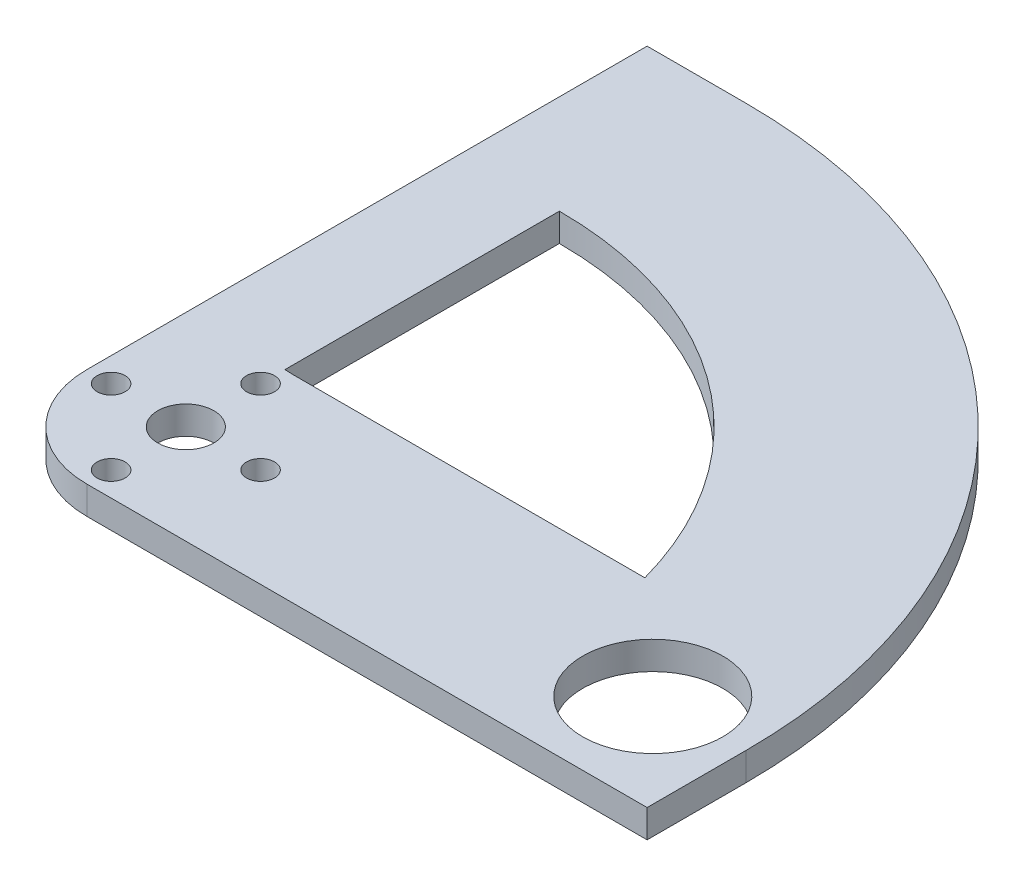
ISO-10303-21;
HEADER;
FILE_DESCRIPTION(('STEP AP214'),'2;1');
FILE_NAME('part.step','',(''),(''),'','','');
FILE_SCHEMA(('AUTOMOTIVE_DESIGN { 1 0 10303 214 1 1 1 1 }'));
ENDSEC;
DATA;
#1=APPLICATION_CONTEXT('core data for automotive mechanical design processes');
#2=APPLICATION_PROTOCOL_DEFINITION('international standard','automotive_design',2000,#1);
#3=PRODUCT_CONTEXT('',#1,'mechanical');
#4=PRODUCT('Part','Part','',(#3));
#5=PRODUCT_RELATED_PRODUCT_CATEGORY('part','',(#4));
#6=PRODUCT_DEFINITION_FORMATION('','',#4);
#7=PRODUCT_DEFINITION_CONTEXT('part definition',#1,'design');
#8=PRODUCT_DEFINITION('design','',#6,#7);
#9=PRODUCT_DEFINITION_SHAPE('','',#8);
#10=(LENGTH_UNIT() NAMED_UNIT(*) SI_UNIT(.MILLI.,.METRE.));
#11=(NAMED_UNIT(*) PLANE_ANGLE_UNIT() SI_UNIT($,.RADIAN.));
#12=(NAMED_UNIT(*) SI_UNIT($,.STERADIAN.) SOLID_ANGLE_UNIT());
#13=UNCERTAINTY_MEASURE_WITH_UNIT(LENGTH_MEASURE(1.E-05),#10,'distance_accuracy_value','');
#14=(GEOMETRIC_REPRESENTATION_CONTEXT(3) GLOBAL_UNCERTAINTY_ASSIGNED_CONTEXT((#13)) GLOBAL_UNIT_ASSIGNED_CONTEXT((#10,
#11,#12)) REPRESENTATION_CONTEXT('',''));
#15=CARTESIAN_POINT('',(0.,0.,0.));
#16=DIRECTION('',(0.,0.,1.));
#17=DIRECTION('',(1.,0.,0.));
#18=AXIS2_PLACEMENT_3D('',#15,#16,#17);
#19=CARTESIAN_POINT('',(0.,3.,0.));
#20=DIRECTION('',(0.,-1.,0.));
#21=DIRECTION('',(0.,0.,-1.));
#22=AXIS2_PLACEMENT_3D('',#19,#20,#21);
#23=PLANE('',#22);
#24=CARTESIAN_POINT('',(0.,3.,8.));
#25=DIRECTION('',(0.,1.,0.));
#26=DIRECTION('',(0.,0.,1.));
#27=AXIS2_PLACEMENT_3D('',#24,#25,#26);
#28=CIRCLE('',#27,1.5);
#29=CARTESIAN_POINT('',(0.,3.,9.5));
#30=VERTEX_POINT('',#29);
#31=EDGE_CURVE('E228',#30,#30,#28,.T.);
#32=ORIENTED_EDGE('',*,*,#31,.F.);
#33=EDGE_LOOP('',(#32));
#34=FACE_BOUND('',#33,.T.);
#35=CARTESIAN_POINT('',(-8.,3.,0.));
#36=DIRECTION('',(0.,1.,0.));
#37=DIRECTION('',(0.,0.,1.));
#38=AXIS2_PLACEMENT_3D('',#35,#36,#37);
#39=CIRCLE('',#38,1.5);
#40=CARTESIAN_POINT('',(-8.,3.,1.5));
#41=VERTEX_POINT('',#40);
#42=EDGE_CURVE('E222',#41,#41,#39,.T.);
#43=ORIENTED_EDGE('',*,*,#42,.F.);
#44=EDGE_LOOP('',(#43));
#45=FACE_BOUND('',#44,.T.);
#46=CARTESIAN_POINT('',(0.,3.,-8.));
#47=DIRECTION('',(0.,1.,0.));
#48=DIRECTION('',(0.,0.,1.));
#49=AXIS2_PLACEMENT_3D('',#46,#47,#48);
#50=CIRCLE('',#49,1.5);
#51=CARTESIAN_POINT('',(0.,3.,-6.5));
#52=VERTEX_POINT('',#51);
#53=EDGE_CURVE('E216',#52,#52,#50,.T.);
#54=ORIENTED_EDGE('',*,*,#53,.F.);
#55=EDGE_LOOP('',(#54));
#56=FACE_BOUND('',#55,.T.);
#57=CARTESIAN_POINT('',(8.,3.,0.));
#58=DIRECTION('',(0.,1.,0.));
#59=DIRECTION('',(0.,0.,1.));
#60=AXIS2_PLACEMENT_3D('',#57,#58,#59);
#61=CIRCLE('',#60,1.5);
#62=CARTESIAN_POINT('',(8.,3.,1.5));
#63=VERTEX_POINT('',#62);
#64=EDGE_CURVE('E210',#63,#63,#61,.T.);
#65=ORIENTED_EDGE('',*,*,#64,.F.);
#66=EDGE_LOOP('',(#65));
#67=FACE_BOUND('',#66,.T.);
#68=DIRECTION('',(0.,0.,-1.));
#69=VECTOR('',#68,1.);
#70=CARTESIAN_POINT('',(0.,3.,0.));
#71=LINE('',#70,#69);
#72=CARTESIAN_POINT('',(0.,3.,-10.6066017177982));
#73=VERTEX_POINT('',#72);
#74=CARTESIAN_POINT('',(0.,3.,-40.));
#75=VERTEX_POINT('',#74);
#76=EDGE_CURVE('E56',#73,#75,#71,.T.);
#77=ORIENTED_EDGE('',*,*,#76,.T.);
#78=CARTESIAN_POINT('',(0.,3.,0.));
#79=DIRECTION('',(0.,1.,0.));
#80=DIRECTION('',(0.,0.,1.));
#81=AXIS2_PLACEMENT_3D('',#78,#79,#80);
#82=CIRCLE('',#81,40.);
#83=CARTESIAN_POINT('',(38.5759452619692,3.,-10.5781117003724));
#84=VERTEX_POINT('',#83);
#85=EDGE_CURVE('E187',#84,#75,#82,.T.);
#86=ORIENTED_EDGE('',*,*,#85,.F.);
#87=DIRECTION('',(1.,0.,0.));
#88=VECTOR('',#87,1.);
#89=CARTESIAN_POINT('',(0.,3.,-10.5781117003724));
#90=LINE('',#89,#88);
#91=CARTESIAN_POINT('',(0.776886641952511,3.,-10.5781117003724));
#92=VERTEX_POINT('',#91);
#93=EDGE_CURVE('E191',#92,#84,#90,.T.);
#94=ORIENTED_EDGE('',*,*,#93,.F.);
#95=CARTESIAN_POINT('',(0.,3.,0.));
#96=DIRECTION('',(0.,1.,0.));
#97=DIRECTION('',(0.,0.,1.));
#98=AXIS2_PLACEMENT_3D('',#95,#96,#97);
#99=CIRCLE('',#98,10.6066017177982);
#100=EDGE_CURVE('E194',#73,#92,#99,.F.);
#101=ORIENTED_EDGE('',*,*,#100,.F.);
#102=EDGE_LOOP('',(#77,#86,#94,#101));
#103=FACE_BOUND('',#102,.T.);
#104=CARTESIAN_POINT('',(0.,3.,0.));
#105=DIRECTION('',(0.,1.,0.));
#106=DIRECTION('',(0.,0.,1.));
#107=AXIS2_PLACEMENT_3D('',#104,#105,#106);
#108=CIRCLE('',#107,3.);
#109=CARTESIAN_POINT('',(0.,3.,3.));
#110=VERTEX_POINT('',#109);
#111=EDGE_CURVE('E156',#110,#110,#108,.T.);
#112=ORIENTED_EDGE('',*,*,#111,.F.);
#113=EDGE_LOOP('',(#112));
#114=FACE_BOUND('',#113,.T.);
#115=CARTESIAN_POINT('',(50.,3.,0.));
#116=DIRECTION('',(0.,1.,0.));
#117=DIRECTION('',(0.,0.,1.));
#118=AXIS2_PLACEMENT_3D('',#115,#116,#117);
#119=CIRCLE('',#118,7.5);
#120=CARTESIAN_POINT('',(50.,3.,7.5));
#121=VERTEX_POINT('',#120);
#122=EDGE_CURVE('E171',#121,#121,#119,.T.);
#123=ORIENTED_EDGE('',*,*,#122,.F.);
#124=EDGE_LOOP('',(#123));
#125=FACE_BOUND('',#124,.T.);
#126=DIRECTION('',(0.,0.,1.));
#127=VECTOR('',#126,1.);
#128=CARTESIAN_POINT('',(-10.6066017177982,3.,-60.));
#129=LINE('',#128,#127);
#130=CARTESIAN_POINT('',(-10.6066017177982,3.,-60.));
#131=VERTEX_POINT('',#130);
#132=CARTESIAN_POINT('',(-10.6066017177982,3.,0.));
#133=VERTEX_POINT('',#132);
#134=EDGE_CURVE('E164',#131,#133,#129,.T.);
#135=ORIENTED_EDGE('',*,*,#134,.T.);
#136=CARTESIAN_POINT('',(0.,3.,0.));
#137=DIRECTION('',(0.,1.,0.));
#138=DIRECTION('',(0.,0.,1.));
#139=AXIS2_PLACEMENT_3D('',#136,#137,#138);
#140=CIRCLE('',#139,10.6066017177982);
#141=CARTESIAN_POINT('',(0.,3.,10.6066017177982));
#142=VERTEX_POINT('',#141);
#143=EDGE_CURVE('E111',#142,#133,#140,.F.);
#144=ORIENTED_EDGE('',*,*,#143,.F.);
#145=DIRECTION('',(1.,0.,0.));
#146=VECTOR('',#145,1.);
#147=CARTESIAN_POINT('',(-10.6066017177982,3.,10.6066017177982));
#148=LINE('',#147,#146);
#149=CARTESIAN_POINT('',(60.,3.,10.6066017177982));
#150=VERTEX_POINT('',#149);
#151=EDGE_CURVE('E162',#142,#150,#148,.T.);
#152=ORIENTED_EDGE('',*,*,#151,.T.);
#153=DIRECTION('',(0.,0.,-1.));
#154=VECTOR('',#153,1.);
#155=CARTESIAN_POINT('',(60.,3.,0.));
#156=LINE('',#155,#154);
#157=CARTESIAN_POINT('',(60.,3.,0.));
#158=VERTEX_POINT('',#157);
#159=EDGE_CURVE('E143',#150,#158,#156,.T.);
#160=ORIENTED_EDGE('',*,*,#159,.T.);
#161=CARTESIAN_POINT('',(0.,3.,0.));
#162=DIRECTION('',(0.,1.,0.));
#163=DIRECTION('',(0.,0.,-1.));
#164=AXIS2_PLACEMENT_3D('',#161,#162,#163);
#165=CIRCLE('',#164,60.);
#166=CARTESIAN_POINT('',(0.,3.,-60.));
#167=VERTEX_POINT('',#166);
#168=EDGE_CURVE('E138',#158,#167,#165,.T.);
#169=ORIENTED_EDGE('',*,*,#168,.T.);
#170=DIRECTION('',(-1.,0.,0.));
#171=VECTOR('',#170,1.);
#172=CARTESIAN_POINT('',(0.,3.,-60.));
#173=LINE('',#172,#171);
#174=EDGE_CURVE('E166',#167,#131,#173,.T.);
#175=ORIENTED_EDGE('',*,*,#174,.T.);
#176=EDGE_LOOP('',(#135,#144,#152,#160,#169,#175));
#177=FACE_BOUND('',#176,.T.);
#178=ADVANCED_FACE('F33',(#34,#45,#56,#67,#103,#114,#125,#177),#23,.F.);
#179=CARTESIAN_POINT('',(0.,0.,0.));
#180=DIRECTION('',(0.,-1.,0.));
#181=DIRECTION('',(0.,0.,-1.));
#182=AXIS2_PLACEMENT_3D('',#179,#180,#181);
#183=PLANE('',#182);
#184=CARTESIAN_POINT('',(0.,0.,8.));
#185=DIRECTION('',(0.,1.,0.));
#186=DIRECTION('',(0.,0.,1.));
#187=AXIS2_PLACEMENT_3D('',#184,#185,#186);
#188=CIRCLE('',#187,1.5);
#189=CARTESIAN_POINT('',(0.,0.,9.5));
#190=VERTEX_POINT('',#189);
#191=EDGE_CURVE('E213',#190,#190,#188,.T.);
#192=ORIENTED_EDGE('',*,*,#191,.T.);
#193=EDGE_LOOP('',(#192));
#194=FACE_BOUND('',#193,.T.);
#195=CARTESIAN_POINT('',(-8.,0.,0.));
#196=DIRECTION('',(0.,1.,0.));
#197=DIRECTION('',(0.,0.,1.));
#198=AXIS2_PLACEMENT_3D('',#195,#196,#197);
#199=CIRCLE('',#198,1.5);
#200=CARTESIAN_POINT('',(-8.,0.,1.5));
#201=VERTEX_POINT('',#200);
#202=EDGE_CURVE('E225',#201,#201,#199,.T.);
#203=ORIENTED_EDGE('',*,*,#202,.T.);
#204=EDGE_LOOP('',(#203));
#205=FACE_BOUND('',#204,.T.);
#206=CARTESIAN_POINT('',(0.,0.,-8.));
#207=DIRECTION('',(0.,1.,0.));
#208=DIRECTION('',(0.,0.,1.));
#209=AXIS2_PLACEMENT_3D('',#206,#207,#208);
#210=CIRCLE('',#209,1.5);
#211=CARTESIAN_POINT('',(0.,0.,-6.5));
#212=VERTEX_POINT('',#211);
#213=EDGE_CURVE('E219',#212,#212,#210,.T.);
#214=ORIENTED_EDGE('',*,*,#213,.T.);
#215=EDGE_LOOP('',(#214));
#216=FACE_BOUND('',#215,.T.);
#217=CARTESIAN_POINT('',(8.,0.,0.));
#218=DIRECTION('',(0.,1.,0.));
#219=DIRECTION('',(0.,0.,1.));
#220=AXIS2_PLACEMENT_3D('',#217,#218,#219);
#221=CIRCLE('',#220,1.5);
#222=CARTESIAN_POINT('',(8.,0.,1.5));
#223=VERTEX_POINT('',#222);
#224=EDGE_CURVE('E208',#223,#223,#221,.T.);
#225=ORIENTED_EDGE('',*,*,#224,.T.);
#226=EDGE_LOOP('',(#225));
#227=FACE_BOUND('',#226,.T.);
#228=CARTESIAN_POINT('',(50.,0.,0.));
#229=DIRECTION('',(0.,1.,0.));
#230=DIRECTION('',(0.,0.,1.));
#231=AXIS2_PLACEMENT_3D('',#228,#229,#230);
#232=CIRCLE('',#231,7.5);
#233=CARTESIAN_POINT('',(50.,0.,7.5));
#234=VERTEX_POINT('',#233);
#235=EDGE_CURVE('E173',#234,#234,#232,.T.);
#236=ORIENTED_EDGE('',*,*,#235,.T.);
#237=EDGE_LOOP('',(#236));
#238=FACE_BOUND('',#237,.T.);
#239=CARTESIAN_POINT('',(0.,0.,0.));
#240=DIRECTION('',(0.,1.,0.));
#241=DIRECTION('',(0.,0.,1.));
#242=AXIS2_PLACEMENT_3D('',#239,#240,#241);
#243=CIRCLE('',#242,3.);
#244=CARTESIAN_POINT('',(0.,0.,3.));
#245=VERTEX_POINT('',#244);
#246=EDGE_CURVE('E158',#245,#245,#243,.T.);
#247=ORIENTED_EDGE('',*,*,#246,.T.);
#248=EDGE_LOOP('',(#247));
#249=FACE_BOUND('',#248,.T.);
#250=CARTESIAN_POINT('',(0.,0.,0.));
#251=DIRECTION('',(0.,1.,0.));
#252=DIRECTION('',(0.,0.,1.));
#253=AXIS2_PLACEMENT_3D('',#250,#251,#252);
#254=CIRCLE('',#253,40.);
#255=CARTESIAN_POINT('',(38.5759452619692,0.,-10.5781117003724));
#256=VERTEX_POINT('',#255);
#257=CARTESIAN_POINT('',(0.,0.,-40.));
#258=VERTEX_POINT('',#257);
#259=EDGE_CURVE('E182',#256,#258,#254,.T.);
#260=ORIENTED_EDGE('',*,*,#259,.T.);
#261=DIRECTION('',(0.,0.,-1.));
#262=VECTOR('',#261,1.);
#263=CARTESIAN_POINT('',(0.,0.,0.));
#264=LINE('',#263,#262);
#265=CARTESIAN_POINT('',(0.,0.,-10.6066017177982));
#266=VERTEX_POINT('',#265);
#267=EDGE_CURVE('E190',#266,#258,#264,.T.);
#268=ORIENTED_EDGE('',*,*,#267,.F.);
#269=CARTESIAN_POINT('',(0.,0.,0.));
#270=DIRECTION('',(0.,1.,0.));
#271=DIRECTION('',(0.,0.,1.));
#272=AXIS2_PLACEMENT_3D('',#269,#270,#271);
#273=CIRCLE('',#272,10.6066017177982);
#274=CARTESIAN_POINT('',(0.776886641952511,0.,-10.5781117003724));
#275=VERTEX_POINT('',#274);
#276=EDGE_CURVE('E203',#266,#275,#273,.F.);
#277=ORIENTED_EDGE('',*,*,#276,.T.);
#278=DIRECTION('',(1.,0.,0.));
#279=VECTOR('',#278,1.);
#280=CARTESIAN_POINT('',(0.,0.,-10.5781117003724));
#281=LINE('',#280,#279);
#282=EDGE_CURVE('E200',#275,#256,#281,.T.);
#283=ORIENTED_EDGE('',*,*,#282,.T.);
#284=EDGE_LOOP('',(#260,#268,#277,#283));
#285=FACE_BOUND('',#284,.T.);
#286=CARTESIAN_POINT('',(0.,0.,0.));
#287=DIRECTION('',(0.,1.,0.));
#288=DIRECTION('',(0.,0.,1.));
#289=AXIS2_PLACEMENT_3D('',#286,#287,#288);
#290=CIRCLE('',#289,10.6066017177982);
#291=CARTESIAN_POINT('',(0.,0.,10.6066017177982));
#292=VERTEX_POINT('',#291);
#293=CARTESIAN_POINT('',(-10.6066017177982,0.,0.));
#294=VERTEX_POINT('',#293);
#295=EDGE_CURVE('E48',#292,#294,#290,.F.);
#296=ORIENTED_EDGE('',*,*,#295,.T.);
#297=DIRECTION('',(0.,0.,1.));
#298=VECTOR('',#297,1.);
#299=CARTESIAN_POINT('',(-10.6066017177982,0.,-60.));
#300=LINE('',#299,#298);
#301=CARTESIAN_POINT('',(-10.6066017177982,0.,-60.));
#302=VERTEX_POINT('',#301);
#303=EDGE_CURVE('E122',#302,#294,#300,.T.);
#304=ORIENTED_EDGE('',*,*,#303,.F.);
#305=DIRECTION('',(-1.,0.,0.));
#306=VECTOR('',#305,1.);
#307=CARTESIAN_POINT('',(0.,0.,-60.));
#308=LINE('',#307,#306);
#309=CARTESIAN_POINT('',(0.,0.,-60.));
#310=VERTEX_POINT('',#309);
#311=EDGE_CURVE('E129',#310,#302,#308,.T.);
#312=ORIENTED_EDGE('',*,*,#311,.F.);
#313=CARTESIAN_POINT('',(0.,0.,0.));
#314=DIRECTION('',(0.,1.,0.));
#315=DIRECTION('',(0.,0.,-1.));
#316=AXIS2_PLACEMENT_3D('',#313,#314,#315);
#317=CIRCLE('',#316,60.);
#318=CARTESIAN_POINT('',(60.,0.,0.));
#319=VERTEX_POINT('',#318);
#320=EDGE_CURVE('E133',#319,#310,#317,.T.);
#321=ORIENTED_EDGE('',*,*,#320,.F.);
#322=DIRECTION('',(0.,0.,-1.));
#323=VECTOR('',#322,1.);
#324=CARTESIAN_POINT('',(60.,0.,0.));
#325=LINE('',#324,#323);
#326=CARTESIAN_POINT('',(60.,0.,10.6066017177982));
#327=VERTEX_POINT('',#326);
#328=EDGE_CURVE('E131',#327,#319,#325,.T.);
#329=ORIENTED_EDGE('',*,*,#328,.F.);
#330=DIRECTION('',(1.,0.,0.));
#331=VECTOR('',#330,1.);
#332=CARTESIAN_POINT('',(-10.6066017177982,0.,10.6066017177982));
#333=LINE('',#332,#331);
#334=EDGE_CURVE('E124',#292,#327,#333,.T.);
#335=ORIENTED_EDGE('',*,*,#334,.F.);
#336=EDGE_LOOP('',(#296,#304,#312,#321,#329,#335));
#337=FACE_BOUND('',#336,.T.);
#338=ADVANCED_FACE('F121',(#194,#205,#216,#227,#238,#249,#285,#337),#183,.T.);
#339=CARTESIAN_POINT('',(-10.6066017177982,3.,-60.));
#340=DIRECTION('',(1.,0.,0.));
#341=DIRECTION('',(0.,0.,-1.));
#342=AXIS2_PLACEMENT_3D('',#339,#340,#341);
#343=PLANE('',#342);
#344=DIRECTION('',(0.,1.,0.));
#345=VECTOR('',#344,1.);
#346=CARTESIAN_POINT('',(-10.6066017177982,0.,0.));
#347=LINE('',#346,#345);
#348=EDGE_CURVE('E108',#294,#133,#347,.T.);
#349=ORIENTED_EDGE('',*,*,#348,.T.);
#350=ORIENTED_EDGE('',*,*,#134,.F.);
#351=DIRECTION('',(0.,-1.,0.));
#352=VECTOR('',#351,1.);
#353=CARTESIAN_POINT('',(-10.6066017177982,3.,-60.));
#354=LINE('',#353,#352);
#355=EDGE_CURVE('E41',#131,#302,#354,.T.);
#356=ORIENTED_EDGE('',*,*,#355,.T.);
#357=ORIENTED_EDGE('',*,*,#303,.T.);
#358=EDGE_LOOP('',(#349,#350,#356,#357));
#359=FACE_BOUND('',#358,.T.);
#360=ADVANCED_FACE('F127',(#359),#343,.F.);
#361=CARTESIAN_POINT('',(0.,3.,0.));
#362=DIRECTION('',(0.,-1.,0.));
#363=DIRECTION('',(0.,0.,-1.));
#364=AXIS2_PLACEMENT_3D('',#361,#362,#363);
#365=CYLINDRICAL_SURFACE('',#364,60.);
#366=ORIENTED_EDGE('',*,*,#320,.T.);
#367=DIRECTION('',(0.,-1.,0.));
#368=VECTOR('',#367,1.);
#369=CARTESIAN_POINT('',(0.,3.,-60.));
#370=LINE('',#369,#368);
#371=EDGE_CURVE('E11',#167,#310,#370,.T.);
#372=ORIENTED_EDGE('',*,*,#371,.F.);
#373=ORIENTED_EDGE('',*,*,#168,.F.);
#374=DIRECTION('',(0.,-1.,0.));
#375=VECTOR('',#374,1.);
#376=CARTESIAN_POINT('',(60.,3.,0.));
#377=LINE('',#376,#375);
#378=EDGE_CURVE('E139',#158,#319,#377,.T.);
#379=ORIENTED_EDGE('',*,*,#378,.T.);
#380=EDGE_LOOP('',(#366,#372,#373,#379));
#381=FACE_BOUND('',#380,.T.);
#382=ADVANCED_FACE('F35',(#381),#365,.T.);
#383=CARTESIAN_POINT('',(0.,3.,-60.));
#384=DIRECTION('',(0.,0.,1.));
#385=DIRECTION('',(1.,0.,0.));
#386=AXIS2_PLACEMENT_3D('',#383,#384,#385);
#387=PLANE('',#386);
#388=ORIENTED_EDGE('',*,*,#311,.T.);
#389=ORIENTED_EDGE('',*,*,#355,.F.);
#390=ORIENTED_EDGE('',*,*,#174,.F.);
#391=ORIENTED_EDGE('',*,*,#371,.T.);
#392=EDGE_LOOP('',(#388,#389,#390,#391));
#393=FACE_BOUND('',#392,.T.);
#394=ADVANCED_FACE('F261',(#393),#387,.F.);
#395=CARTESIAN_POINT('',(-10.6066017177982,3.,10.6066017177982));
#396=DIRECTION('',(0.,0.,-1.));
#397=DIRECTION('',(-1.,0.,0.));
#398=AXIS2_PLACEMENT_3D('',#395,#396,#397);
#399=PLANE('',#398);
#400=ORIENTED_EDGE('',*,*,#151,.F.);
#401=DIRECTION('',(0.,1.,0.));
#402=VECTOR('',#401,1.);
#403=CARTESIAN_POINT('',(0.,0.,10.6066017177982));
#404=LINE('',#403,#402);
#405=EDGE_CURVE('E116',#292,#142,#404,.T.);
#406=ORIENTED_EDGE('',*,*,#405,.F.);
#407=ORIENTED_EDGE('',*,*,#334,.T.);
#408=DIRECTION('',(0.,-1.,0.));
#409=VECTOR('',#408,1.);
#410=CARTESIAN_POINT('',(60.,3.,10.6066017177982));
#411=LINE('',#410,#409);
#412=EDGE_CURVE('E142',#150,#327,#411,.T.);
#413=ORIENTED_EDGE('',*,*,#412,.F.);
#414=EDGE_LOOP('',(#400,#406,#407,#413));
#415=FACE_BOUND('',#414,.T.);
#416=ADVANCED_FACE('F267',(#415),#399,.F.);
#417=CARTESIAN_POINT('',(60.,3.,0.));
#418=DIRECTION('',(-1.,0.,0.));
#419=DIRECTION('',(0.,0.,1.));
#420=AXIS2_PLACEMENT_3D('',#417,#418,#419);
#421=PLANE('',#420);
#422=ORIENTED_EDGE('',*,*,#328,.T.);
#423=ORIENTED_EDGE('',*,*,#378,.F.);
#424=ORIENTED_EDGE('',*,*,#159,.F.);
#425=ORIENTED_EDGE('',*,*,#412,.T.);
#426=EDGE_LOOP('',(#422,#423,#424,#425));
#427=FACE_BOUND('',#426,.T.);
#428=ADVANCED_FACE('F148',(#427),#421,.F.);
#429=CARTESIAN_POINT('',(0.,3.,0.));
#430=DIRECTION('',(0.,-1.,0.));
#431=DIRECTION('',(0.,0.,-1.));
#432=AXIS2_PLACEMENT_3D('',#429,#430,#431);
#433=CYLINDRICAL_SURFACE('',#432,3.);
#434=ORIENTED_EDGE('',*,*,#111,.T.);
#435=EDGE_LOOP('',(#434));
#436=FACE_BOUND('',#435,.T.);
#437=ORIENTED_EDGE('',*,*,#246,.F.);
#438=EDGE_LOOP('',(#437));
#439=FACE_BOUND('',#438,.T.);
#440=ADVANCED_FACE('F278',(#436,#439),#433,.F.);
#441=CARTESIAN_POINT('',(50.,3.,0.));
#442=DIRECTION('',(0.,-1.,0.));
#443=DIRECTION('',(0.,0.,-1.));
#444=AXIS2_PLACEMENT_3D('',#441,#442,#443);
#445=CYLINDRICAL_SURFACE('',#444,7.5);
#446=ORIENTED_EDGE('',*,*,#122,.T.);
#447=EDGE_LOOP('',(#446));
#448=FACE_BOUND('',#447,.T.);
#449=ORIENTED_EDGE('',*,*,#235,.F.);
#450=EDGE_LOOP('',(#449));
#451=FACE_BOUND('',#450,.T.);
#452=ADVANCED_FACE('F282',(#448,#451),#445,.F.);
#453=CARTESIAN_POINT('',(0.,0.,0.));
#454=DIRECTION('',(1.,0.,0.));
#455=DIRECTION('',(0.,0.,-1.));
#456=AXIS2_PLACEMENT_3D('',#453,#454,#455);
#457=PLANE('',#456);
#458=ORIENTED_EDGE('',*,*,#76,.F.);
#459=DIRECTION('',(0.,1.,0.));
#460=VECTOR('',#459,1.);
#461=CARTESIAN_POINT('',(0.,0.,-10.6066017177982));
#462=LINE('',#461,#460);
#463=EDGE_CURVE('E179',#266,#73,#462,.T.);
#464=ORIENTED_EDGE('',*,*,#463,.F.);
#465=ORIENTED_EDGE('',*,*,#267,.T.);
#466=DIRECTION('',(0.,1.,0.));
#467=VECTOR('',#466,1.);
#468=CARTESIAN_POINT('',(0.,0.,-40.));
#469=LINE('',#468,#467);
#470=EDGE_CURVE('E176',#258,#75,#469,.T.);
#471=ORIENTED_EDGE('',*,*,#470,.T.);
#472=EDGE_LOOP('',(#458,#464,#465,#471));
#473=FACE_BOUND('',#472,.T.);
#474=ADVANCED_FACE('F286',(#473),#457,.T.);
#475=CARTESIAN_POINT('',(0.,0.,0.));
#476=DIRECTION('',(0.,1.,0.));
#477=DIRECTION('',(0.,0.,1.));
#478=AXIS2_PLACEMENT_3D('',#475,#476,#477);
#479=CYLINDRICAL_SURFACE('',#478,40.);
#480=ORIENTED_EDGE('',*,*,#85,.T.);
#481=ORIENTED_EDGE('',*,*,#470,.F.);
#482=ORIENTED_EDGE('',*,*,#259,.F.);
#483=DIRECTION('',(0.,1.,0.));
#484=VECTOR('',#483,1.);
#485=CARTESIAN_POINT('',(38.5759452619692,0.,-10.5781117003724));
#486=LINE('',#485,#484);
#487=EDGE_CURVE('E184',#256,#84,#486,.T.);
#488=ORIENTED_EDGE('',*,*,#487,.T.);
#489=EDGE_LOOP('',(#480,#481,#482,#488));
#490=FACE_BOUND('',#489,.T.);
#491=ADVANCED_FACE('F290',(#490),#479,.F.);
#492=CARTESIAN_POINT('',(0.,0.,-10.5781117003724));
#493=DIRECTION('',(0.,0.,1.));
#494=DIRECTION('',(1.,0.,0.));
#495=AXIS2_PLACEMENT_3D('',#492,#493,#494);
#496=PLANE('',#495);
#497=ORIENTED_EDGE('',*,*,#93,.T.);
#498=ORIENTED_EDGE('',*,*,#487,.F.);
#499=ORIENTED_EDGE('',*,*,#282,.F.);
#500=DIRECTION('',(0.,1.,0.));
#501=VECTOR('',#500,1.);
#502=CARTESIAN_POINT('',(0.776886641952511,0.,-10.5781117003724));
#503=LINE('',#502,#501);
#504=EDGE_CURVE('E181',#275,#92,#503,.T.);
#505=ORIENTED_EDGE('',*,*,#504,.T.);
#506=EDGE_LOOP('',(#497,#498,#499,#505));
#507=FACE_BOUND('',#506,.T.);
#508=ADVANCED_FACE('F294',(#507),#496,.F.);
#509=CARTESIAN_POINT('',(0.,0.,0.));
#510=DIRECTION('',(0.,1.,0.));
#511=DIRECTION('',(0.,0.,1.));
#512=AXIS2_PLACEMENT_3D('',#509,#510,#511);
#513=CYLINDRICAL_SURFACE('',#512,10.6066017177982);
#514=ORIENTED_EDGE('',*,*,#100,.T.);
#515=ORIENTED_EDGE('',*,*,#504,.F.);
#516=ORIENTED_EDGE('',*,*,#276,.F.);
#517=ORIENTED_EDGE('',*,*,#463,.T.);
#518=EDGE_LOOP('',(#514,#515,#516,#517));
#519=FACE_BOUND('',#518,.T.);
#520=ADVANCED_FACE('F291',(#519),#513,.T.);
#521=CARTESIAN_POINT('',(0.,0.,0.));
#522=DIRECTION('',(0.,1.,0.));
#523=DIRECTION('',(0.,0.,1.));
#524=AXIS2_PLACEMENT_3D('',#521,#522,#523);
#525=CYLINDRICAL_SURFACE('',#524,10.6066017177982);
#526=ORIENTED_EDGE('',*,*,#143,.T.);
#527=ORIENTED_EDGE('',*,*,#348,.F.);
#528=ORIENTED_EDGE('',*,*,#295,.F.);
#529=ORIENTED_EDGE('',*,*,#405,.T.);
#530=EDGE_LOOP('',(#526,#527,#528,#529));
#531=FACE_BOUND('',#530,.T.);
#532=ADVANCED_FACE('F109',(#531),#525,.T.);
#533=CARTESIAN_POINT('',(8.,0.,0.));
#534=DIRECTION('',(0.,1.,0.));
#535=DIRECTION('',(0.,0.,1.));
#536=AXIS2_PLACEMENT_3D('',#533,#534,#535);
#537=CYLINDRICAL_SURFACE('',#536,1.5);
#538=ORIENTED_EDGE('',*,*,#224,.F.);
#539=EDGE_LOOP('',(#538));
#540=FACE_BOUND('',#539,.T.);
#541=ORIENTED_EDGE('',*,*,#64,.T.);
#542=EDGE_LOOP('',(#541));
#543=FACE_BOUND('',#542,.T.);
#544=ADVANCED_FACE('F304',(#540,#543),#537,.F.);
#545=CARTESIAN_POINT('',(0.,0.,-8.));
#546=DIRECTION('',(0.,1.,0.));
#547=DIRECTION('',(0.,0.,1.));
#548=AXIS2_PLACEMENT_3D('',#545,#546,#547);
#549=CYLINDRICAL_SURFACE('',#548,1.5);
#550=ORIENTED_EDGE('',*,*,#213,.F.);
#551=EDGE_LOOP('',(#550));
#552=FACE_BOUND('',#551,.T.);
#553=ORIENTED_EDGE('',*,*,#53,.T.);
#554=EDGE_LOOP('',(#553));
#555=FACE_BOUND('',#554,.T.);
#556=ADVANCED_FACE('F307',(#552,#555),#549,.F.);
#557=CARTESIAN_POINT('',(-8.,0.,0.));
#558=DIRECTION('',(0.,1.,0.));
#559=DIRECTION('',(0.,0.,1.));
#560=AXIS2_PLACEMENT_3D('',#557,#558,#559);
#561=CYLINDRICAL_SURFACE('',#560,1.5);
#562=ORIENTED_EDGE('',*,*,#202,.F.);
#563=EDGE_LOOP('',(#562));
#564=FACE_BOUND('',#563,.T.);
#565=ORIENTED_EDGE('',*,*,#42,.T.);
#566=EDGE_LOOP('',(#565));
#567=FACE_BOUND('',#566,.T.);
#568=ADVANCED_FACE('F239',(#564,#567),#561,.F.);
#569=CARTESIAN_POINT('',(0.,0.,8.));
#570=DIRECTION('',(0.,1.,0.));
#571=DIRECTION('',(0.,0.,1.));
#572=AXIS2_PLACEMENT_3D('',#569,#570,#571);
#573=CYLINDRICAL_SURFACE('',#572,1.5);
#574=ORIENTED_EDGE('',*,*,#191,.F.);
#575=EDGE_LOOP('',(#574));
#576=FACE_BOUND('',#575,.T.);
#577=ORIENTED_EDGE('',*,*,#31,.T.);
#578=EDGE_LOOP('',(#577));
#579=FACE_BOUND('',#578,.T.);
#580=ADVANCED_FACE('F236',(#576,#579),#573,.F.);
#581=CLOSED_SHELL('',(#178,#338,#360,#382,#394,#416,#428,#440,#452,#474,#491,#508,#520,#532,
#544,#556,#568,#580));
#582=MANIFOLD_SOLID_BREP('B2',#581);
#583=ADVANCED_BREP_SHAPE_REPRESENTATION('',(#18,#582),#14);
#584=SHAPE_DEFINITION_REPRESENTATION(#9,#583);
ENDSEC;
END-ISO-10303-21;
